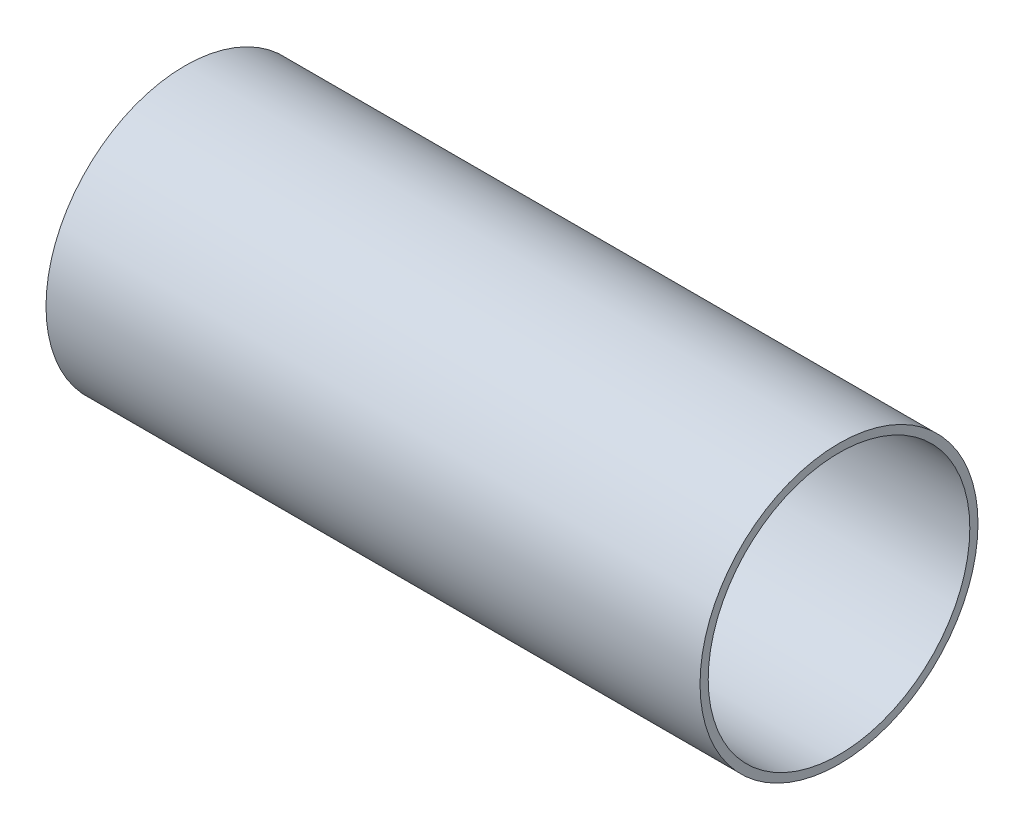
ISO-10303-21;
HEADER;
FILE_DESCRIPTION(('STEP AP214'),'2;1');
FILE_NAME('part.step','',(''),(''),'','','');
FILE_SCHEMA(('AUTOMOTIVE_DESIGN { 1 0 10303 214 1 1 1 1 }'));
ENDSEC;
DATA;
#1=APPLICATION_CONTEXT('core data for automotive mechanical design processes');
#2=APPLICATION_PROTOCOL_DEFINITION('international standard','automotive_design',2000,#1);
#3=PRODUCT_CONTEXT('',#1,'mechanical');
#4=PRODUCT('Part','Part','',(#3));
#5=PRODUCT_RELATED_PRODUCT_CATEGORY('part','',(#4));
#6=PRODUCT_DEFINITION_FORMATION('','',#4);
#7=PRODUCT_DEFINITION_CONTEXT('part definition',#1,'design');
#8=PRODUCT_DEFINITION('design','',#6,#7);
#9=PRODUCT_DEFINITION_SHAPE('','',#8);
#10=(LENGTH_UNIT() NAMED_UNIT(*) SI_UNIT(.MILLI.,.METRE.));
#11=(NAMED_UNIT(*) PLANE_ANGLE_UNIT() SI_UNIT($,.RADIAN.));
#12=(NAMED_UNIT(*) SI_UNIT($,.STERADIAN.) SOLID_ANGLE_UNIT());
#13=UNCERTAINTY_MEASURE_WITH_UNIT(LENGTH_MEASURE(1.E-05),#10,'distance_accuracy_value','');
#14=(GEOMETRIC_REPRESENTATION_CONTEXT(3) GLOBAL_UNCERTAINTY_ASSIGNED_CONTEXT((#13)) GLOBAL_UNIT_ASSIGNED_CONTEXT((#10,
#11,#12)) REPRESENTATION_CONTEXT('',''));
#15=CARTESIAN_POINT('',(0.,0.,0.));
#16=DIRECTION('',(0.,0.,1.));
#17=DIRECTION('',(1.,0.,0.));
#18=AXIS2_PLACEMENT_3D('',#15,#16,#17);
#19=CARTESIAN_POINT('',(0.,0.,-4.25));
#20=DIRECTION('',(1.,0.,0.));
#21=DIRECTION('',(0.,0.,-1.));
#22=AXIS2_PLACEMENT_3D('',#19,#20,#21);
#23=PLANE('',#22);
#24=CARTESIAN_POINT('',(0.,0.,0.));
#25=DIRECTION('',(1.,0.,0.));
#26=DIRECTION('',(0.,0.,-1.));
#27=AXIS2_PLACEMENT_3D('',#24,#25,#26);
#28=CIRCLE('',#27,4.25);
#29=CARTESIAN_POINT('',(0.,0.,-4.25));
#30=VERTEX_POINT('',#29);
#31=EDGE_CURVE('E45',#30,#30,#28,.T.);
#32=ORIENTED_EDGE('',*,*,#31,.T.);
#33=EDGE_LOOP('',(#32));
#34=FACE_BOUND('',#33,.T.);
#35=CARTESIAN_POINT('',(0.,0.,0.));
#36=DIRECTION('',(1.,0.,0.));
#37=DIRECTION('',(0.,0.,-1.));
#38=AXIS2_PLACEMENT_3D('',#35,#36,#37);
#39=CIRCLE('',#38,4.);
#40=CARTESIAN_POINT('',(0.,0.,-4.));
#41=VERTEX_POINT('',#40);
#42=EDGE_CURVE('E10',#41,#41,#39,.T.);
#43=ORIENTED_EDGE('',*,*,#42,.F.);
#44=EDGE_LOOP('',(#43));
#45=FACE_BOUND('',#44,.T.);
#46=ADVANCED_FACE('F31',(#34,#45),#23,.T.);
#47=CARTESIAN_POINT('',(0.,0.,0.));
#48=DIRECTION('',(1.,0.,0.));
#49=DIRECTION('',(0.,0.,-1.));
#50=AXIS2_PLACEMENT_3D('',#47,#48,#49);
#51=CYLINDRICAL_SURFACE('',#50,4.);
#52=ORIENTED_EDGE('',*,*,#42,.T.);
#53=EDGE_LOOP('',(#52));
#54=FACE_BOUND('',#53,.T.);
#55=CARTESIAN_POINT('',(-20.,0.,0.));
#56=DIRECTION('',(1.,0.,0.));
#57=DIRECTION('',(0.,0.,-1.));
#58=AXIS2_PLACEMENT_3D('',#55,#56,#57);
#59=CIRCLE('',#58,4.);
#60=CARTESIAN_POINT('',(-20.,0.,-4.));
#61=VERTEX_POINT('',#60);
#62=EDGE_CURVE('E37',#61,#61,#59,.T.);
#63=ORIENTED_EDGE('',*,*,#62,.F.);
#64=EDGE_LOOP('',(#63));
#65=FACE_BOUND('',#64,.T.);
#66=ADVANCED_FACE('F61',(#54,#65),#51,.F.);
#67=CARTESIAN_POINT('',(-20.,0.,-4.));
#68=DIRECTION('',(-1.,0.,0.));
#69=DIRECTION('',(0.,0.,1.));
#70=AXIS2_PLACEMENT_3D('',#67,#68,#69);
#71=PLANE('',#70);
#72=ORIENTED_EDGE('',*,*,#62,.T.);
#73=EDGE_LOOP('',(#72));
#74=FACE_BOUND('',#73,.T.);
#75=CARTESIAN_POINT('',(-20.,0.,0.));
#76=DIRECTION('',(1.,0.,0.));
#77=DIRECTION('',(0.,0.,-1.));
#78=AXIS2_PLACEMENT_3D('',#75,#76,#77);
#79=CIRCLE('',#78,4.25);
#80=CARTESIAN_POINT('',(-20.,0.,-4.25));
#81=VERTEX_POINT('',#80);
#82=EDGE_CURVE('E41',#81,#81,#79,.T.);
#83=ORIENTED_EDGE('',*,*,#82,.F.);
#84=EDGE_LOOP('',(#83));
#85=FACE_BOUND('',#84,.T.);
#86=ADVANCED_FACE('F55',(#74,#85),#71,.T.);
#87=CARTESIAN_POINT('',(0.,0.,0.));
#88=DIRECTION('',(1.,0.,0.));
#89=DIRECTION('',(0.,0.,-1.));
#90=AXIS2_PLACEMENT_3D('',#87,#88,#89);
#91=CYLINDRICAL_SURFACE('',#90,4.25);
#92=ORIENTED_EDGE('',*,*,#82,.T.);
#93=EDGE_LOOP('',(#92));
#94=FACE_BOUND('',#93,.T.);
#95=ORIENTED_EDGE('',*,*,#31,.F.);
#96=EDGE_LOOP('',(#95));
#97=FACE_BOUND('',#96,.T.);
#98=ADVANCED_FACE('F53',(#94,#97),#91,.T.);
#99=CLOSED_SHELL('',(#46,#66,#86,#98));
#100=MANIFOLD_SOLID_BREP('B2',#99);
#101=ADVANCED_BREP_SHAPE_REPRESENTATION('',(#18,#100),#14);
#102=SHAPE_DEFINITION_REPRESENTATION(#9,#101);
ENDSEC;
END-ISO-10303-21;
